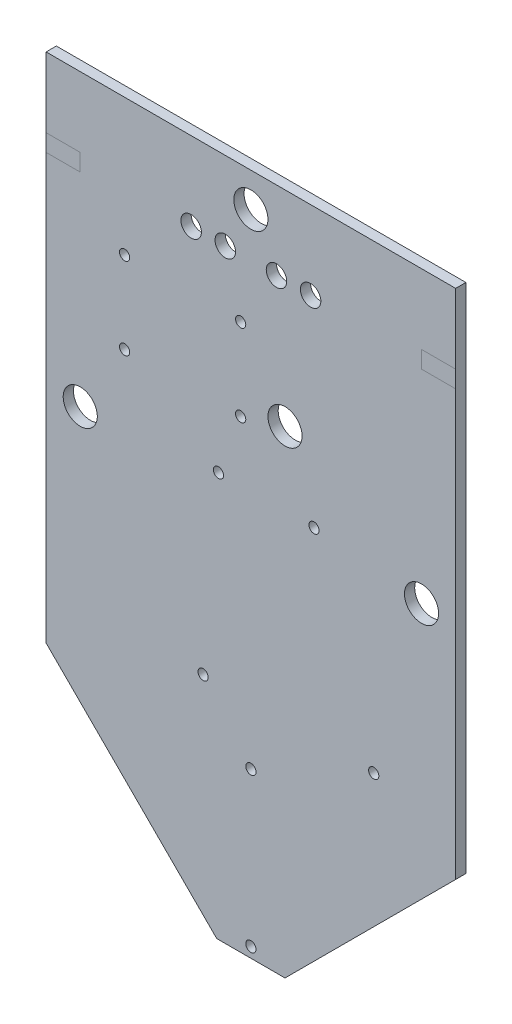
ISO-10303-21;
HEADER;
FILE_DESCRIPTION(('STEP AP214'),'2;1');
FILE_NAME('part.step','',(''),(''),'','','');
FILE_SCHEMA(('AUTOMOTIVE_DESIGN { 1 0 10303 214 1 1 1 1 }'));
ENDSEC;
DATA;
#1=APPLICATION_CONTEXT('core data for automotive mechanical design processes');
#2=APPLICATION_PROTOCOL_DEFINITION('international standard','automotive_design',2000,#1);
#3=PRODUCT_CONTEXT('',#1,'mechanical');
#4=PRODUCT('Part','Part','',(#3));
#5=PRODUCT_RELATED_PRODUCT_CATEGORY('part','',(#4));
#6=PRODUCT_DEFINITION_FORMATION('','',#4);
#7=PRODUCT_DEFINITION_CONTEXT('part definition',#1,'design');
#8=PRODUCT_DEFINITION('design','',#6,#7);
#9=PRODUCT_DEFINITION_SHAPE('','',#8);
#10=(LENGTH_UNIT() NAMED_UNIT(*) SI_UNIT(.MILLI.,.METRE.));
#11=(NAMED_UNIT(*) PLANE_ANGLE_UNIT() SI_UNIT($,.RADIAN.));
#12=(NAMED_UNIT(*) SI_UNIT($,.STERADIAN.) SOLID_ANGLE_UNIT());
#13=UNCERTAINTY_MEASURE_WITH_UNIT(LENGTH_MEASURE(1.E-05),#10,'distance_accuracy_value','');
#14=(GEOMETRIC_REPRESENTATION_CONTEXT(3) GLOBAL_UNCERTAINTY_ASSIGNED_CONTEXT((#13)) GLOBAL_UNIT_ASSIGNED_CONTEXT((#10,
#11,#12)) REPRESENTATION_CONTEXT('',''));
#15=CARTESIAN_POINT('',(0.,0.,0.));
#16=DIRECTION('',(0.,0.,1.));
#17=DIRECTION('',(1.,0.,0.));
#18=AXIS2_PLACEMENT_3D('',#15,#16,#17);
#19=CARTESIAN_POINT('',(0.,-200.,3.));
#20=DIRECTION('',(0.,0.,-1.));
#21=DIRECTION('',(-1.,0.,0.));
#22=AXIS2_PLACEMENT_3D('',#19,#20,#21);
#23=PLANE('',#22);
#24=CARTESIAN_POINT('',(-60.0000000000002,-197.,3.));
#25=DIRECTION('',(0.,0.,-1.));
#26=DIRECTION('',(-1.,0.,0.));
#27=AXIS2_PLACEMENT_3D('',#24,#25,#26);
#28=CIRCLE('',#27,1.5);
#29=CARTESIAN_POINT('',(-61.5000000000002,-197.,3.));
#30=VERTEX_POINT('',#29);
#31=EDGE_CURVE('E197',#30,#30,#28,.T.);
#32=ORIENTED_EDGE('',*,*,#31,.T.);
#33=EDGE_LOOP('',(#32));
#34=FACE_BOUND('',#33,.T.);
#35=CARTESIAN_POINT('',(-60.0000000000002,-152.,3.));
#36=DIRECTION('',(0.,0.,-1.));
#37=DIRECTION('',(-1.,0.,0.));
#38=AXIS2_PLACEMENT_3D('',#35,#36,#37);
#39=CIRCLE('',#38,1.5);
#40=CARTESIAN_POINT('',(-61.5000000000002,-152.,3.));
#41=VERTEX_POINT('',#40);
#42=EDGE_CURVE('E203',#41,#41,#39,.T.);
#43=ORIENTED_EDGE('',*,*,#42,.T.);
#44=EDGE_LOOP('',(#43));
#45=FACE_BOUND('',#44,.T.);
#46=CARTESIAN_POINT('',(-77.5,-23.,3.));
#47=DIRECTION('',(0.,0.,-1.));
#48=DIRECTION('',(-1.,0.,0.));
#49=AXIS2_PLACEMENT_3D('',#46,#47,#48);
#50=CIRCLE('',#49,3.00000000000001);
#51=CARTESIAN_POINT('',(-80.5,-23.,3.));
#52=VERTEX_POINT('',#51);
#53=EDGE_CURVE('E209',#52,#52,#50,.T.);
#54=ORIENTED_EDGE('',*,*,#53,.T.);
#55=EDGE_LOOP('',(#54));
#56=FACE_BOUND('',#55,.T.);
#57=CARTESIAN_POINT('',(-67.5,-23.,3.));
#58=DIRECTION('',(0.,0.,-1.));
#59=DIRECTION('',(-1.,0.,0.));
#60=AXIS2_PLACEMENT_3D('',#57,#58,#59);
#61=CIRCLE('',#60,3.00000000000001);
#62=CARTESIAN_POINT('',(-70.5,-23.,3.));
#63=VERTEX_POINT('',#62);
#64=EDGE_CURVE('E215',#63,#63,#61,.T.);
#65=ORIENTED_EDGE('',*,*,#64,.T.);
#66=EDGE_LOOP('',(#65));
#67=FACE_BOUND('',#66,.T.);
#68=CARTESIAN_POINT('',(-42.5,-23.,3.));
#69=DIRECTION('',(0.,0.,-1.));
#70=DIRECTION('',(-1.,0.,0.));
#71=AXIS2_PLACEMENT_3D('',#68,#69,#70);
#72=CIRCLE('',#71,3.);
#73=CARTESIAN_POINT('',(-45.5,-23.,3.));
#74=VERTEX_POINT('',#73);
#75=EDGE_CURVE('E221',#74,#74,#72,.T.);
#76=ORIENTED_EDGE('',*,*,#75,.T.);
#77=EDGE_LOOP('',(#76));
#78=FACE_BOUND('',#77,.T.);
#79=CARTESIAN_POINT('',(-52.5,-23.,3.));
#80=DIRECTION('',(0.,0.,-1.));
#81=DIRECTION('',(-1.,0.,0.));
#82=AXIS2_PLACEMENT_3D('',#79,#80,#81);
#83=CIRCLE('',#82,3.);
#84=CARTESIAN_POINT('',(-55.5,-23.,3.));
#85=VERTEX_POINT('',#84);
#86=EDGE_CURVE('E227',#85,#85,#83,.T.);
#87=ORIENTED_EDGE('',*,*,#86,.T.);
#88=EDGE_LOOP('',(#87));
#89=FACE_BOUND('',#88,.T.);
#90=CARTESIAN_POINT('',(-63.,-64.,3.));
#91=DIRECTION('',(0.,0.,-1.));
#92=DIRECTION('',(-1.,0.,0.));
#93=AXIS2_PLACEMENT_3D('',#90,#91,#92);
#94=CIRCLE('',#93,1.5);
#95=CARTESIAN_POINT('',(-64.5,-64.,3.));
#96=VERTEX_POINT('',#95);
#97=EDGE_CURVE('E239',#96,#96,#94,.F.);
#98=ORIENTED_EDGE('',*,*,#97,.F.);
#99=EDGE_LOOP('',(#98));
#100=FACE_BOUND('',#99,.T.);
#101=CARTESIAN_POINT('',(-97.,-40.,3.));
#102=DIRECTION('',(0.,0.,-1.));
#103=DIRECTION('',(-1.,0.,0.));
#104=AXIS2_PLACEMENT_3D('',#101,#102,#103);
#105=CIRCLE('',#104,1.5);
#106=CARTESIAN_POINT('',(-98.5,-40.,3.));
#107=VERTEX_POINT('',#106);
#108=EDGE_CURVE('E251',#107,#107,#105,.F.);
#109=ORIENTED_EDGE('',*,*,#108,.F.);
#110=EDGE_LOOP('',(#109));
#111=FACE_BOUND('',#110,.T.);
#112=CARTESIAN_POINT('',(-110.,-84.9999999999999,3.));
#113=DIRECTION('',(0.,0.,-1.));
#114=DIRECTION('',(-1.,0.,0.));
#115=AXIS2_PLACEMENT_3D('',#112,#113,#114);
#116=CIRCLE('',#115,5.00000000000002);
#117=CARTESIAN_POINT('',(-115.,-84.9999999999999,3.));
#118=VERTEX_POINT('',#117);
#119=EDGE_CURVE('E257',#118,#118,#116,.T.);
#120=ORIENTED_EDGE('',*,*,#119,.T.);
#121=EDGE_LOOP('',(#120));
#122=FACE_BOUND('',#121,.T.);
#123=CARTESIAN_POINT('',(-9.99999999999992,-85.,3.));
#124=DIRECTION('',(0.,0.,-1.));
#125=DIRECTION('',(-1.,0.,0.));
#126=AXIS2_PLACEMENT_3D('',#123,#124,#125);
#127=CIRCLE('',#126,5.);
#128=CARTESIAN_POINT('',(-14.9999999999999,-85.,3.));
#129=VERTEX_POINT('',#128);
#130=EDGE_CURVE('E263',#129,#129,#127,.T.);
#131=ORIENTED_EDGE('',*,*,#130,.T.);
#132=EDGE_LOOP('',(#131));
#133=FACE_BOUND('',#132,.T.);
#134=CARTESIAN_POINT('',(-60.,-10.,3.));
#135=DIRECTION('',(0.,0.,-1.));
#136=DIRECTION('',(-1.,0.,0.));
#137=AXIS2_PLACEMENT_3D('',#134,#135,#136);
#138=CIRCLE('',#137,5.);
#139=CARTESIAN_POINT('',(-65.,-10.,3.));
#140=VERTEX_POINT('',#139);
#141=EDGE_CURVE('E269',#140,#140,#138,.T.);
#142=ORIENTED_EDGE('',*,*,#141,.T.);
#143=EDGE_LOOP('',(#142));
#144=FACE_BOUND('',#143,.T.);
#145=CARTESIAN_POINT('',(-50.,-60.,3.));
#146=DIRECTION('',(0.,0.,-1.));
#147=DIRECTION('',(-1.,0.,0.));
#148=AXIS2_PLACEMENT_3D('',#145,#146,#147);
#149=CIRCLE('',#148,5.);
#150=CARTESIAN_POINT('',(-55.,-60.,3.));
#151=VERTEX_POINT('',#150);
#152=EDGE_CURVE('E275',#151,#151,#149,.T.);
#153=ORIENTED_EDGE('',*,*,#152,.T.);
#154=EDGE_LOOP('',(#153));
#155=FACE_BOUND('',#154,.T.);
#156=CARTESIAN_POINT('',(-74.,-135.,3.));
#157=DIRECTION('',(0.,0.,-1.));
#158=DIRECTION('',(-1.,0.,0.));
#159=AXIS2_PLACEMENT_3D('',#156,#157,#158);
#160=CIRCLE('',#159,1.5);
#161=CARTESIAN_POINT('',(-75.5,-135.,3.));
#162=VERTEX_POINT('',#161);
#163=EDGE_CURVE('E287',#162,#162,#160,.F.);
#164=ORIENTED_EDGE('',*,*,#163,.F.);
#165=EDGE_LOOP('',(#164));
#166=FACE_BOUND('',#165,.T.);
#167=CARTESIAN_POINT('',(-69.5,-81.5,3.));
#168=DIRECTION('',(0.,0.,-1.));
#169=DIRECTION('',(-1.,0.,0.));
#170=AXIS2_PLACEMENT_3D('',#167,#168,#169);
#171=CIRCLE('',#170,1.5);
#172=CARTESIAN_POINT('',(-71.,-81.5,3.));
#173=VERTEX_POINT('',#172);
#174=EDGE_CURVE('E299',#173,#173,#171,.F.);
#175=ORIENTED_EDGE('',*,*,#174,.F.);
#176=EDGE_LOOP('',(#175));
#177=FACE_BOUND('',#176,.T.);
#178=DIRECTION('',(0.,-1.,0.));
#179=VECTOR('',#178,1.);
#180=CARTESIAN_POINT('',(-9.99999999999999,-20.5,3.));
#181=LINE('',#180,#179);
#182=CARTESIAN_POINT('',(-9.99999999999999,-20.5,3.));
#183=VERTEX_POINT('',#182);
#184=CARTESIAN_POINT('',(-9.99999999999999,-25.5,3.));
#185=VERTEX_POINT('',#184);
#186=EDGE_CURVE('E156',#183,#185,#181,.T.);
#187=ORIENTED_EDGE('',*,*,#186,.F.);
#188=DIRECTION('',(-1.,0.,0.));
#189=VECTOR('',#188,1.);
#190=CARTESIAN_POINT('',(0.,-20.5,3.));
#191=LINE('',#190,#189);
#192=CARTESIAN_POINT('',(0.,-20.5,3.));
#193=VERTEX_POINT('',#192);
#194=EDGE_CURVE('E141',#193,#183,#191,.T.);
#195=ORIENTED_EDGE('',*,*,#194,.F.);
#196=DIRECTION('',(0.,1.,0.));
#197=VECTOR('',#196,1.);
#198=CARTESIAN_POINT('',(0.,-150.,3.));
#199=LINE('',#198,#197);
#200=CARTESIAN_POINT('',(0.,0.,3.));
#201=VERTEX_POINT('',#200);
#202=EDGE_CURVE('E307',#193,#201,#199,.T.);
#203=ORIENTED_EDGE('',*,*,#202,.T.);
#204=DIRECTION('',(-1.,0.,0.));
#205=VECTOR('',#204,1.);
#206=CARTESIAN_POINT('',(0.,0.,3.));
#207=LINE('',#206,#205);
#208=CARTESIAN_POINT('',(-120.,0.,3.));
#209=VERTEX_POINT('',#208);
#210=EDGE_CURVE('E306',#201,#209,#207,.T.);
#211=ORIENTED_EDGE('',*,*,#210,.T.);
#212=DIRECTION('',(0.,-1.,0.));
#213=VECTOR('',#212,1.);
#214=CARTESIAN_POINT('',(-120.,0.,3.));
#215=LINE('',#214,#213);
#216=CARTESIAN_POINT('',(-120.,-20.5,3.));
#217=VERTEX_POINT('',#216);
#218=EDGE_CURVE('E310',#209,#217,#215,.T.);
#219=ORIENTED_EDGE('',*,*,#218,.T.);
#220=DIRECTION('',(-1.,0.,0.));
#221=VECTOR('',#220,1.);
#222=CARTESIAN_POINT('',(-120.,-20.5,3.));
#223=LINE('',#222,#221);
#224=CARTESIAN_POINT('',(-110.,-20.5,3.));
#225=VERTEX_POINT('',#224);
#226=EDGE_CURVE('E173',#225,#217,#223,.T.);
#227=ORIENTED_EDGE('',*,*,#226,.F.);
#228=DIRECTION('',(0.,1.,0.));
#229=VECTOR('',#228,1.);
#230=CARTESIAN_POINT('',(-110.,-20.5,3.));
#231=LINE('',#230,#229);
#232=CARTESIAN_POINT('',(-110.,-25.5,3.));
#233=VERTEX_POINT('',#232);
#234=EDGE_CURVE('E182',#233,#225,#231,.T.);
#235=ORIENTED_EDGE('',*,*,#234,.F.);
#236=DIRECTION('',(1.,0.,0.));
#237=VECTOR('',#236,1.);
#238=CARTESIAN_POINT('',(-120.,-25.5,3.));
#239=LINE('',#238,#237);
#240=CARTESIAN_POINT('',(-120.,-25.5,3.));
#241=VERTEX_POINT('',#240);
#242=EDGE_CURVE('E165',#241,#233,#239,.T.);
#243=ORIENTED_EDGE('',*,*,#242,.F.);
#244=CARTESIAN_POINT('',(-120.,-150.,3.));
#245=VERTEX_POINT('',#244);
#246=EDGE_CURVE('E309',#241,#245,#215,.T.);
#247=ORIENTED_EDGE('',*,*,#246,.T.);
#248=DIRECTION('',(0.707106781186546,-0.707106781186549,0.));
#249=VECTOR('',#248,1.);
#250=CARTESIAN_POINT('',(-120.,-150.,3.));
#251=LINE('',#250,#249);
#252=CARTESIAN_POINT('',(-70.0000000000002,-200.,3.));
#253=VERTEX_POINT('',#252);
#254=EDGE_CURVE('E313',#245,#253,#251,.T.);
#255=ORIENTED_EDGE('',*,*,#254,.T.);
#256=DIRECTION('',(1.,0.,0.));
#257=VECTOR('',#256,1.);
#258=CARTESIAN_POINT('',(-70.0000000000002,-200.,3.));
#259=LINE('',#258,#257);
#260=CARTESIAN_POINT('',(-50.0000000000002,-200.,3.));
#261=VERTEX_POINT('',#260);
#262=EDGE_CURVE('E315',#253,#261,#259,.T.);
#263=ORIENTED_EDGE('',*,*,#262,.T.);
#264=DIRECTION('',(0.707106781186548,0.707106781186547,0.));
#265=VECTOR('',#264,1.);
#266=CARTESIAN_POINT('',(-50.0000000000002,-200.,3.));
#267=LINE('',#266,#265);
#268=CARTESIAN_POINT('',(0.,-150.,3.));
#269=VERTEX_POINT('',#268);
#270=EDGE_CURVE('E317',#261,#269,#267,.T.);
#271=ORIENTED_EDGE('',*,*,#270,.T.);
#272=CARTESIAN_POINT('',(0.,-25.5,3.));
#273=VERTEX_POINT('',#272);
#274=EDGE_CURVE('E303',#269,#273,#199,.T.);
#275=ORIENTED_EDGE('',*,*,#274,.T.);
#276=DIRECTION('',(1.,0.,0.));
#277=VECTOR('',#276,1.);
#278=CARTESIAN_POINT('',(0.,-25.5,3.));
#279=LINE('',#278,#277);
#280=EDGE_CURVE('E154',#185,#273,#279,.T.);
#281=ORIENTED_EDGE('',*,*,#280,.F.);
#282=EDGE_LOOP('',(#187,#195,#203,#211,#219,#227,#235,#243,#247,#255,#263,#271,#275,#281));
#283=FACE_BOUND('',#282,.T.);
#284=CARTESIAN_POINT('',(-41.5,-81.5,3.));
#285=DIRECTION('',(0.,0.,-1.));
#286=DIRECTION('',(-1.,0.,0.));
#287=AXIS2_PLACEMENT_3D('',#284,#285,#286);
#288=CIRCLE('',#287,1.5);
#289=CARTESIAN_POINT('',(-43.,-81.5,3.));
#290=VERTEX_POINT('',#289);
#291=EDGE_CURVE('E293',#290,#290,#288,.F.);
#292=ORIENTED_EDGE('',*,*,#291,.F.);
#293=EDGE_LOOP('',(#292));
#294=FACE_BOUND('',#293,.T.);
#295=CARTESIAN_POINT('',(-24.,-135.,3.));
#296=DIRECTION('',(0.,0.,-1.));
#297=DIRECTION('',(-1.,0.,0.));
#298=AXIS2_PLACEMENT_3D('',#295,#296,#297);
#299=CIRCLE('',#298,1.5);
#300=CARTESIAN_POINT('',(-25.5,-135.,3.));
#301=VERTEX_POINT('',#300);
#302=EDGE_CURVE('E281',#301,#301,#299,.F.);
#303=ORIENTED_EDGE('',*,*,#302,.F.);
#304=EDGE_LOOP('',(#303));
#305=FACE_BOUND('',#304,.T.);
#306=CARTESIAN_POINT('',(-63.,-40.,3.));
#307=DIRECTION('',(0.,0.,-1.));
#308=DIRECTION('',(-1.,0.,0.));
#309=AXIS2_PLACEMENT_3D('',#306,#307,#308);
#310=CIRCLE('',#309,1.5);
#311=CARTESIAN_POINT('',(-64.5,-40.,3.));
#312=VERTEX_POINT('',#311);
#313=EDGE_CURVE('E245',#312,#312,#310,.F.);
#314=ORIENTED_EDGE('',*,*,#313,.F.);
#315=EDGE_LOOP('',(#314));
#316=FACE_BOUND('',#315,.T.);
#317=CARTESIAN_POINT('',(-97.,-64.,3.));
#318=DIRECTION('',(0.,0.,-1.));
#319=DIRECTION('',(-1.,0.,0.));
#320=AXIS2_PLACEMENT_3D('',#317,#318,#319);
#321=CIRCLE('',#320,1.5);
#322=CARTESIAN_POINT('',(-98.5,-64.,3.));
#323=VERTEX_POINT('',#322);
#324=EDGE_CURVE('E233',#323,#323,#321,.F.);
#325=ORIENTED_EDGE('',*,*,#324,.F.);
#326=EDGE_LOOP('',(#325));
#327=FACE_BOUND('',#326,.T.);
#328=ADVANCED_FACE('F31',(#34,#45,#56,#67,#78,#89,#100,#111,#122,#133,#144,#155,#166,#177,#283,
#294,#305,#316,#327),#23,.F.);
#329=CARTESIAN_POINT('',(0.,-200.,0.));
#330=DIRECTION('',(0.,0.,-1.));
#331=DIRECTION('',(-1.,0.,0.));
#332=AXIS2_PLACEMENT_3D('',#329,#330,#331);
#333=PLANE('',#332);
#334=CARTESIAN_POINT('',(-60.0000000000002,-197.,0.));
#335=DIRECTION('',(0.,0.,-1.));
#336=DIRECTION('',(-1.,0.,0.));
#337=AXIS2_PLACEMENT_3D('',#334,#335,#336);
#338=CIRCLE('',#337,1.5);
#339=CARTESIAN_POINT('',(-61.5000000000002,-197.,0.));
#340=VERTEX_POINT('',#339);
#341=EDGE_CURVE('E189',#340,#340,#338,.T.);
#342=ORIENTED_EDGE('',*,*,#341,.F.);
#343=EDGE_LOOP('',(#342));
#344=FACE_BOUND('',#343,.T.);
#345=CARTESIAN_POINT('',(-60.0000000000002,-152.,0.));
#346=DIRECTION('',(0.,0.,-1.));
#347=DIRECTION('',(-1.,0.,0.));
#348=AXIS2_PLACEMENT_3D('',#345,#346,#347);
#349=CIRCLE('',#348,1.5);
#350=CARTESIAN_POINT('',(-61.5000000000002,-152.,0.));
#351=VERTEX_POINT('',#350);
#352=EDGE_CURVE('E200',#351,#351,#349,.T.);
#353=ORIENTED_EDGE('',*,*,#352,.F.);
#354=EDGE_LOOP('',(#353));
#355=FACE_BOUND('',#354,.T.);
#356=CARTESIAN_POINT('',(-77.5,-23.,0.));
#357=DIRECTION('',(0.,0.,-1.));
#358=DIRECTION('',(1.,0.,0.));
#359=AXIS2_PLACEMENT_3D('',#356,#357,#358);
#360=CIRCLE('',#359,3.00000000000001);
#361=CARTESIAN_POINT('',(-74.5,-23.,0.));
#362=VERTEX_POINT('',#361);
#363=EDGE_CURVE('E206',#362,#362,#360,.T.);
#364=ORIENTED_EDGE('',*,*,#363,.F.);
#365=EDGE_LOOP('',(#364));
#366=FACE_BOUND('',#365,.T.);
#367=CARTESIAN_POINT('',(-67.5,-23.,0.));
#368=DIRECTION('',(0.,0.,-1.));
#369=DIRECTION('',(1.,0.,0.));
#370=AXIS2_PLACEMENT_3D('',#367,#368,#369);
#371=CIRCLE('',#370,3.00000000000001);
#372=CARTESIAN_POINT('',(-64.5,-23.,0.));
#373=VERTEX_POINT('',#372);
#374=EDGE_CURVE('E212',#373,#373,#371,.T.);
#375=ORIENTED_EDGE('',*,*,#374,.F.);
#376=EDGE_LOOP('',(#375));
#377=FACE_BOUND('',#376,.T.);
#378=CARTESIAN_POINT('',(-42.5,-23.,0.));
#379=DIRECTION('',(0.,0.,-1.));
#380=DIRECTION('',(-1.,0.,0.));
#381=AXIS2_PLACEMENT_3D('',#378,#379,#380);
#382=CIRCLE('',#381,3.);
#383=CARTESIAN_POINT('',(-45.5,-23.,0.));
#384=VERTEX_POINT('',#383);
#385=EDGE_CURVE('E218',#384,#384,#382,.T.);
#386=ORIENTED_EDGE('',*,*,#385,.F.);
#387=EDGE_LOOP('',(#386));
#388=FACE_BOUND('',#387,.T.);
#389=CARTESIAN_POINT('',(-52.5,-23.,0.));
#390=DIRECTION('',(0.,0.,-1.));
#391=DIRECTION('',(-1.,0.,0.));
#392=AXIS2_PLACEMENT_3D('',#389,#390,#391);
#393=CIRCLE('',#392,3.);
#394=CARTESIAN_POINT('',(-55.5,-23.,0.));
#395=VERTEX_POINT('',#394);
#396=EDGE_CURVE('E224',#395,#395,#393,.T.);
#397=ORIENTED_EDGE('',*,*,#396,.F.);
#398=EDGE_LOOP('',(#397));
#399=FACE_BOUND('',#398,.T.);
#400=CARTESIAN_POINT('',(-63.,-64.,0.));
#401=DIRECTION('',(0.,0.,1.));
#402=DIRECTION('',(1.,0.,0.));
#403=AXIS2_PLACEMENT_3D('',#400,#401,#402);
#404=CIRCLE('',#403,1.5);
#405=CARTESIAN_POINT('',(-61.5,-64.,0.));
#406=VERTEX_POINT('',#405);
#407=EDGE_CURVE('E236',#406,#406,#404,.T.);
#408=ORIENTED_EDGE('',*,*,#407,.T.);
#409=EDGE_LOOP('',(#408));
#410=FACE_BOUND('',#409,.T.);
#411=CARTESIAN_POINT('',(-97.,-40.,0.));
#412=DIRECTION('',(0.,0.,1.));
#413=DIRECTION('',(1.,0.,0.));
#414=AXIS2_PLACEMENT_3D('',#411,#412,#413);
#415=CIRCLE('',#414,1.5);
#416=CARTESIAN_POINT('',(-95.5,-40.,0.));
#417=VERTEX_POINT('',#416);
#418=EDGE_CURVE('E248',#417,#417,#415,.T.);
#419=ORIENTED_EDGE('',*,*,#418,.T.);
#420=EDGE_LOOP('',(#419));
#421=FACE_BOUND('',#420,.T.);
#422=CARTESIAN_POINT('',(-110.,-84.9999999999999,0.));
#423=DIRECTION('',(0.,0.,-1.));
#424=DIRECTION('',(-1.,0.,0.));
#425=AXIS2_PLACEMENT_3D('',#422,#423,#424);
#426=CIRCLE('',#425,5.00000000000002);
#427=CARTESIAN_POINT('',(-115.,-84.9999999999999,0.));
#428=VERTEX_POINT('',#427);
#429=EDGE_CURVE('E254',#428,#428,#426,.T.);
#430=ORIENTED_EDGE('',*,*,#429,.F.);
#431=EDGE_LOOP('',(#430));
#432=FACE_BOUND('',#431,.T.);
#433=CARTESIAN_POINT('',(-9.99999999999992,-85.,0.));
#434=DIRECTION('',(0.,0.,-1.));
#435=DIRECTION('',(-1.,0.,0.));
#436=AXIS2_PLACEMENT_3D('',#433,#434,#435);
#437=CIRCLE('',#436,5.);
#438=CARTESIAN_POINT('',(-14.9999999999999,-85.,0.));
#439=VERTEX_POINT('',#438);
#440=EDGE_CURVE('E260',#439,#439,#437,.T.);
#441=ORIENTED_EDGE('',*,*,#440,.F.);
#442=EDGE_LOOP('',(#441));
#443=FACE_BOUND('',#442,.T.);
#444=CARTESIAN_POINT('',(-60.,-10.,0.));
#445=DIRECTION('',(0.,0.,-1.));
#446=DIRECTION('',(-1.,0.,0.));
#447=AXIS2_PLACEMENT_3D('',#444,#445,#446);
#448=CIRCLE('',#447,5.);
#449=CARTESIAN_POINT('',(-65.,-10.,0.));
#450=VERTEX_POINT('',#449);
#451=EDGE_CURVE('E266',#450,#450,#448,.T.);
#452=ORIENTED_EDGE('',*,*,#451,.F.);
#453=EDGE_LOOP('',(#452));
#454=FACE_BOUND('',#453,.T.);
#455=CARTESIAN_POINT('',(-50.,-60.,0.));
#456=DIRECTION('',(0.,0.,-1.));
#457=DIRECTION('',(-1.,0.,0.));
#458=AXIS2_PLACEMENT_3D('',#455,#456,#457);
#459=CIRCLE('',#458,5.);
#460=CARTESIAN_POINT('',(-55.,-60.,0.));
#461=VERTEX_POINT('',#460);
#462=EDGE_CURVE('E272',#461,#461,#459,.T.);
#463=ORIENTED_EDGE('',*,*,#462,.F.);
#464=EDGE_LOOP('',(#463));
#465=FACE_BOUND('',#464,.T.);
#466=CARTESIAN_POINT('',(-74.,-135.,0.));
#467=DIRECTION('',(0.,0.,1.));
#468=DIRECTION('',(1.,0.,0.));
#469=AXIS2_PLACEMENT_3D('',#466,#467,#468);
#470=CIRCLE('',#469,1.5);
#471=CARTESIAN_POINT('',(-72.5,-135.,0.));
#472=VERTEX_POINT('',#471);
#473=EDGE_CURVE('E284',#472,#472,#470,.T.);
#474=ORIENTED_EDGE('',*,*,#473,.T.);
#475=EDGE_LOOP('',(#474));
#476=FACE_BOUND('',#475,.T.);
#477=CARTESIAN_POINT('',(-69.5,-81.5,0.));
#478=DIRECTION('',(0.,0.,1.));
#479=DIRECTION('',(1.,0.,0.));
#480=AXIS2_PLACEMENT_3D('',#477,#478,#479);
#481=CIRCLE('',#480,1.5);
#482=CARTESIAN_POINT('',(-68.,-81.5,0.));
#483=VERTEX_POINT('',#482);
#484=EDGE_CURVE('E296',#483,#483,#481,.T.);
#485=ORIENTED_EDGE('',*,*,#484,.T.);
#486=EDGE_LOOP('',(#485));
#487=FACE_BOUND('',#486,.T.);
#488=DIRECTION('',(0.,1.,0.));
#489=VECTOR('',#488,1.);
#490=CARTESIAN_POINT('',(0.,-150.,0.));
#491=LINE('',#490,#489);
#492=CARTESIAN_POINT('',(0.,-150.,0.));
#493=VERTEX_POINT('',#492);
#494=CARTESIAN_POINT('',(0.,0.,0.));
#495=VERTEX_POINT('',#494);
#496=EDGE_CURVE('E302',#493,#495,#491,.T.);
#497=ORIENTED_EDGE('',*,*,#496,.F.);
#498=DIRECTION('',(0.707106781186548,0.707106781186547,0.));
#499=VECTOR('',#498,1.);
#500=CARTESIAN_POINT('',(-50.0000000000002,-200.,0.));
#501=LINE('',#500,#499);
#502=CARTESIAN_POINT('',(-50.0000000000002,-200.,0.));
#503=VERTEX_POINT('',#502);
#504=EDGE_CURVE('E330',#503,#493,#501,.T.);
#505=ORIENTED_EDGE('',*,*,#504,.F.);
#506=DIRECTION('',(1.,0.,0.));
#507=VECTOR('',#506,1.);
#508=CARTESIAN_POINT('',(-70.0000000000002,-200.,0.));
#509=LINE('',#508,#507);
#510=CARTESIAN_POINT('',(-70.0000000000002,-200.,0.));
#511=VERTEX_POINT('',#510);
#512=EDGE_CURVE('E328',#511,#503,#509,.T.);
#513=ORIENTED_EDGE('',*,*,#512,.F.);
#514=DIRECTION('',(0.707106781186546,-0.707106781186549,0.));
#515=VECTOR('',#514,1.);
#516=CARTESIAN_POINT('',(-120.,-150.,0.));
#517=LINE('',#516,#515);
#518=CARTESIAN_POINT('',(-120.,-150.,0.));
#519=VERTEX_POINT('',#518);
#520=EDGE_CURVE('E326',#519,#511,#517,.T.);
#521=ORIENTED_EDGE('',*,*,#520,.F.);
#522=DIRECTION('',(0.,-1.,0.));
#523=VECTOR('',#522,1.);
#524=CARTESIAN_POINT('',(-120.,0.,0.));
#525=LINE('',#524,#523);
#526=CARTESIAN_POINT('',(-120.,0.,0.));
#527=VERTEX_POINT('',#526);
#528=EDGE_CURVE('E324',#527,#519,#525,.T.);
#529=ORIENTED_EDGE('',*,*,#528,.F.);
#530=DIRECTION('',(-1.,0.,0.));
#531=VECTOR('',#530,1.);
#532=CARTESIAN_POINT('',(0.,0.,0.));
#533=LINE('',#532,#531);
#534=EDGE_CURVE('E322',#495,#527,#533,.T.);
#535=ORIENTED_EDGE('',*,*,#534,.F.);
#536=EDGE_LOOP('',(#497,#505,#513,#521,#529,#535));
#537=FACE_BOUND('',#536,.T.);
#538=CARTESIAN_POINT('',(-41.5,-81.5,0.));
#539=DIRECTION('',(0.,0.,1.));
#540=DIRECTION('',(1.,0.,0.));
#541=AXIS2_PLACEMENT_3D('',#538,#539,#540);
#542=CIRCLE('',#541,1.5);
#543=CARTESIAN_POINT('',(-40.,-81.5,0.));
#544=VERTEX_POINT('',#543);
#545=EDGE_CURVE('E290',#544,#544,#542,.T.);
#546=ORIENTED_EDGE('',*,*,#545,.T.);
#547=EDGE_LOOP('',(#546));
#548=FACE_BOUND('',#547,.T.);
#549=CARTESIAN_POINT('',(-24.,-135.,0.));
#550=DIRECTION('',(0.,0.,1.));
#551=DIRECTION('',(1.,0.,0.));
#552=AXIS2_PLACEMENT_3D('',#549,#550,#551);
#553=CIRCLE('',#552,1.5);
#554=CARTESIAN_POINT('',(-22.5,-135.,0.));
#555=VERTEX_POINT('',#554);
#556=EDGE_CURVE('E278',#555,#555,#553,.T.);
#557=ORIENTED_EDGE('',*,*,#556,.T.);
#558=EDGE_LOOP('',(#557));
#559=FACE_BOUND('',#558,.T.);
#560=CARTESIAN_POINT('',(-63.,-40.,0.));
#561=DIRECTION('',(0.,0.,1.));
#562=DIRECTION('',(1.,0.,0.));
#563=AXIS2_PLACEMENT_3D('',#560,#561,#562);
#564=CIRCLE('',#563,1.5);
#565=CARTESIAN_POINT('',(-61.5,-40.,0.));
#566=VERTEX_POINT('',#565);
#567=EDGE_CURVE('E242',#566,#566,#564,.T.);
#568=ORIENTED_EDGE('',*,*,#567,.T.);
#569=EDGE_LOOP('',(#568));
#570=FACE_BOUND('',#569,.T.);
#571=CARTESIAN_POINT('',(-97.,-64.,0.));
#572=DIRECTION('',(0.,0.,1.));
#573=DIRECTION('',(1.,0.,0.));
#574=AXIS2_PLACEMENT_3D('',#571,#572,#573);
#575=CIRCLE('',#574,1.5);
#576=CARTESIAN_POINT('',(-95.5,-64.,0.));
#577=VERTEX_POINT('',#576);
#578=EDGE_CURVE('E230',#577,#577,#575,.T.);
#579=ORIENTED_EDGE('',*,*,#578,.T.);
#580=EDGE_LOOP('',(#579));
#581=FACE_BOUND('',#580,.T.);
#582=ADVANCED_FACE('F355',(#344,#355,#366,#377,#388,#399,#410,#421,#432,#443,#454,#465,#476,
#487,#537,#548,#559,#570,#581),#333,.T.);
#583=CARTESIAN_POINT('',(0.,-150.,3.));
#584=DIRECTION('',(-1.,0.,0.));
#585=DIRECTION('',(0.,0.,1.));
#586=AXIS2_PLACEMENT_3D('',#583,#584,#585);
#587=PLANE('',#586);
#588=ORIENTED_EDGE('',*,*,#202,.F.);
#589=DIRECTION('',(0.,0.,1.));
#590=VECTOR('',#589,1.);
#591=CARTESIAN_POINT('',(0.,-20.5,2.9999));
#592=LINE('',#591,#590);
#593=CARTESIAN_POINT('',(0.,-20.5,2.9999));
#594=VERTEX_POINT('',#593);
#595=EDGE_CURVE('E163',#594,#193,#592,.T.);
#596=ORIENTED_EDGE('',*,*,#595,.F.);
#597=DIRECTION('',(0.,1.,0.));
#598=VECTOR('',#597,1.);
#599=CARTESIAN_POINT('',(0.,-20.5,2.9999));
#600=LINE('',#599,#598);
#601=CARTESIAN_POINT('',(0.,-25.5,2.9999));
#602=VERTEX_POINT('',#601);
#603=EDGE_CURVE('E146',#602,#594,#600,.T.);
#604=ORIENTED_EDGE('',*,*,#603,.F.);
#605=DIRECTION('',(0.,0.,1.));
#606=VECTOR('',#605,1.);
#607=CARTESIAN_POINT('',(0.,-25.5,2.9999));
#608=LINE('',#607,#606);
#609=EDGE_CURVE('E166',#602,#273,#608,.T.);
#610=ORIENTED_EDGE('',*,*,#609,.T.);
#611=ORIENTED_EDGE('',*,*,#274,.F.);
#612=DIRECTION('',(0.,0.,-1.));
#613=VECTOR('',#612,1.);
#614=CARTESIAN_POINT('',(0.,-150.,3.));
#615=LINE('',#614,#613);
#616=EDGE_CURVE('E319',#269,#493,#615,.T.);
#617=ORIENTED_EDGE('',*,*,#616,.T.);
#618=ORIENTED_EDGE('',*,*,#496,.T.);
#619=DIRECTION('',(0.,0.,-1.));
#620=VECTOR('',#619,1.);
#621=CARTESIAN_POINT('',(0.,0.,3.));
#622=LINE('',#621,#620);
#623=EDGE_CURVE('E11',#201,#495,#622,.T.);
#624=ORIENTED_EDGE('',*,*,#623,.F.);
#625=EDGE_LOOP('',(#588,#596,#604,#610,#611,#617,#618,#624));
#626=FACE_BOUND('',#625,.T.);
#627=ADVANCED_FACE('F33',(#626),#587,.F.);
#628=CARTESIAN_POINT('',(0.,0.,3.));
#629=DIRECTION('',(0.,-1.,0.));
#630=DIRECTION('',(1.,0.,0.));
#631=AXIS2_PLACEMENT_3D('',#628,#629,#630);
#632=PLANE('',#631);
#633=ORIENTED_EDGE('',*,*,#534,.T.);
#634=DIRECTION('',(0.,0.,-1.));
#635=VECTOR('',#634,1.);
#636=CARTESIAN_POINT('',(-120.,0.,3.));
#637=LINE('',#636,#635);
#638=EDGE_CURVE('E39',#209,#527,#637,.T.);
#639=ORIENTED_EDGE('',*,*,#638,.F.);
#640=ORIENTED_EDGE('',*,*,#210,.F.);
#641=ORIENTED_EDGE('',*,*,#623,.T.);
#642=EDGE_LOOP('',(#633,#639,#640,#641));
#643=FACE_BOUND('',#642,.T.);
#644=ADVANCED_FACE('F412',(#643),#632,.F.);
#645=CARTESIAN_POINT('',(-120.,0.,3.));
#646=DIRECTION('',(1.,0.,0.));
#647=DIRECTION('',(0.,1.,0.));
#648=AXIS2_PLACEMENT_3D('',#645,#646,#647);
#649=PLANE('',#648);
#650=DIRECTION('',(0.,-1.,0.));
#651=VECTOR('',#650,1.);
#652=CARTESIAN_POINT('',(-120.,-20.5,2.9999));
#653=LINE('',#652,#651);
#654=CARTESIAN_POINT('',(-120.,-20.5,2.9999));
#655=VERTEX_POINT('',#654);
#656=CARTESIAN_POINT('',(-120.,-25.5,2.9999));
#657=VERTEX_POINT('',#656);
#658=EDGE_CURVE('E170',#655,#657,#653,.T.);
#659=ORIENTED_EDGE('',*,*,#658,.F.);
#660=DIRECTION('',(0.,0.,1.));
#661=VECTOR('',#660,1.);
#662=CARTESIAN_POINT('',(-120.,-20.5,2.9999));
#663=LINE('',#662,#661);
#664=EDGE_CURVE('E186',#655,#217,#663,.T.);
#665=ORIENTED_EDGE('',*,*,#664,.T.);
#666=ORIENTED_EDGE('',*,*,#218,.F.);
#667=ORIENTED_EDGE('',*,*,#638,.T.);
#668=ORIENTED_EDGE('',*,*,#528,.T.);
#669=DIRECTION('',(0.,0.,-1.));
#670=VECTOR('',#669,1.);
#671=CARTESIAN_POINT('',(-120.,-150.,3.));
#672=LINE('',#671,#670);
#673=EDGE_CURVE('E340',#245,#519,#672,.T.);
#674=ORIENTED_EDGE('',*,*,#673,.F.);
#675=ORIENTED_EDGE('',*,*,#246,.F.);
#676=DIRECTION('',(0.,0.,1.));
#677=VECTOR('',#676,1.);
#678=CARTESIAN_POINT('',(-120.,-25.5,2.9999));
#679=LINE('',#678,#677);
#680=EDGE_CURVE('E179',#657,#241,#679,.T.);
#681=ORIENTED_EDGE('',*,*,#680,.F.);
#682=EDGE_LOOP('',(#659,#665,#666,#667,#668,#674,#675,#681));
#683=FACE_BOUND('',#682,.T.);
#684=ADVANCED_FACE('F348',(#683),#649,.F.);
#685=CARTESIAN_POINT('',(-120.,-150.,3.));
#686=DIRECTION('',(0.707106781186549,0.707106781186546,0.));
#687=DIRECTION('',(-0.707106781186546,0.707106781186549,0.));
#688=AXIS2_PLACEMENT_3D('',#685,#686,#687);
#689=PLANE('',#688);
#690=ORIENTED_EDGE('',*,*,#520,.T.);
#691=DIRECTION('',(0.,0.,-1.));
#692=VECTOR('',#691,1.);
#693=CARTESIAN_POINT('',(-70.0000000000002,-200.,3.));
#694=LINE('',#693,#692);
#695=EDGE_CURVE('E337',#253,#511,#694,.T.);
#696=ORIENTED_EDGE('',*,*,#695,.F.);
#697=ORIENTED_EDGE('',*,*,#254,.F.);
#698=ORIENTED_EDGE('',*,*,#673,.T.);
#699=EDGE_LOOP('',(#690,#696,#697,#698));
#700=FACE_BOUND('',#699,.T.);
#701=ADVANCED_FACE('F361',(#700),#689,.F.);
#702=CARTESIAN_POINT('',(-70.0000000000002,-200.,3.));
#703=DIRECTION('',(0.,1.,0.));
#704=DIRECTION('',(0.,0.,1.));
#705=AXIS2_PLACEMENT_3D('',#702,#703,#704);
#706=PLANE('',#705);
#707=ORIENTED_EDGE('',*,*,#512,.T.);
#708=DIRECTION('',(0.,0.,-1.));
#709=VECTOR('',#708,1.);
#710=CARTESIAN_POINT('',(-50.0000000000002,-200.,3.));
#711=LINE('',#710,#709);
#712=EDGE_CURVE('E334',#261,#503,#711,.T.);
#713=ORIENTED_EDGE('',*,*,#712,.F.);
#714=ORIENTED_EDGE('',*,*,#262,.F.);
#715=ORIENTED_EDGE('',*,*,#695,.T.);
#716=EDGE_LOOP('',(#707,#713,#714,#715));
#717=FACE_BOUND('',#716,.T.);
#718=ADVANCED_FACE('F365',(#717),#706,.F.);
#719=CARTESIAN_POINT('',(-50.0000000000002,-200.,3.));
#720=DIRECTION('',(-0.707106781186547,0.707106781186548,0.));
#721=DIRECTION('',(-0.707106781186548,-0.707106781186547,0.));
#722=AXIS2_PLACEMENT_3D('',#719,#720,#721);
#723=PLANE('',#722);
#724=ORIENTED_EDGE('',*,*,#504,.T.);
#725=ORIENTED_EDGE('',*,*,#616,.F.);
#726=ORIENTED_EDGE('',*,*,#270,.F.);
#727=ORIENTED_EDGE('',*,*,#712,.T.);
#728=EDGE_LOOP('',(#724,#725,#726,#727));
#729=FACE_BOUND('',#728,.T.);
#730=ADVANCED_FACE('F403',(#729),#723,.F.);
#731=CARTESIAN_POINT('',(-69.5,-81.5,16.));
#732=DIRECTION('',(0.,0.,-1.));
#733=DIRECTION('',(-1.,0.,0.));
#734=AXIS2_PLACEMENT_3D('',#731,#732,#733);
#735=CYLINDRICAL_SURFACE('',#734,1.5);
#736=ORIENTED_EDGE('',*,*,#484,.F.);
#737=EDGE_LOOP('',(#736));
#738=FACE_BOUND('',#737,.T.);
#739=ORIENTED_EDGE('',*,*,#174,.T.);
#740=EDGE_LOOP('',(#739));
#741=FACE_BOUND('',#740,.T.);
#742=ADVANCED_FACE('F400',(#738,#741),#735,.F.);
#743=CARTESIAN_POINT('',(-41.5,-81.5,16.));
#744=DIRECTION('',(0.,0.,-1.));
#745=DIRECTION('',(-1.,0.,0.));
#746=AXIS2_PLACEMENT_3D('',#743,#744,#745);
#747=CYLINDRICAL_SURFACE('',#746,1.5);
#748=ORIENTED_EDGE('',*,*,#545,.F.);
#749=EDGE_LOOP('',(#748));
#750=FACE_BOUND('',#749,.T.);
#751=ORIENTED_EDGE('',*,*,#291,.T.);
#752=EDGE_LOOP('',(#751));
#753=FACE_BOUND('',#752,.T.);
#754=ADVANCED_FACE('F495',(#750,#753),#747,.F.);
#755=CARTESIAN_POINT('',(-74.,-135.,16.));
#756=DIRECTION('',(0.,0.,-1.));
#757=DIRECTION('',(-1.,0.,0.));
#758=AXIS2_PLACEMENT_3D('',#755,#756,#757);
#759=CYLINDRICAL_SURFACE('',#758,1.5);
#760=ORIENTED_EDGE('',*,*,#473,.F.);
#761=EDGE_LOOP('',(#760));
#762=FACE_BOUND('',#761,.T.);
#763=ORIENTED_EDGE('',*,*,#163,.T.);
#764=EDGE_LOOP('',(#763));
#765=FACE_BOUND('',#764,.T.);
#766=ADVANCED_FACE('F492',(#762,#765),#759,.F.);
#767=CARTESIAN_POINT('',(-24.,-135.,16.));
#768=DIRECTION('',(0.,0.,-1.));
#769=DIRECTION('',(-1.,0.,0.));
#770=AXIS2_PLACEMENT_3D('',#767,#768,#769);
#771=CYLINDRICAL_SURFACE('',#770,1.5);
#772=ORIENTED_EDGE('',*,*,#556,.F.);
#773=EDGE_LOOP('',(#772));
#774=FACE_BOUND('',#773,.T.);
#775=ORIENTED_EDGE('',*,*,#302,.T.);
#776=EDGE_LOOP('',(#775));
#777=FACE_BOUND('',#776,.T.);
#778=ADVANCED_FACE('F488',(#774,#777),#771,.F.);
#779=CARTESIAN_POINT('',(-50.,-60.,16.));
#780=DIRECTION('',(0.,0.,-1.));
#781=DIRECTION('',(-1.,0.,0.));
#782=AXIS2_PLACEMENT_3D('',#779,#780,#781);
#783=CYLINDRICAL_SURFACE('',#782,5.);
#784=ORIENTED_EDGE('',*,*,#462,.T.);
#785=EDGE_LOOP('',(#784));
#786=FACE_BOUND('',#785,.T.);
#787=ORIENTED_EDGE('',*,*,#152,.F.);
#788=EDGE_LOOP('',(#787));
#789=FACE_BOUND('',#788,.T.);
#790=ADVANCED_FACE('F484',(#786,#789),#783,.F.);
#791=CARTESIAN_POINT('',(-60.,-10.,16.));
#792=DIRECTION('',(0.,0.,-1.));
#793=DIRECTION('',(-1.,0.,0.));
#794=AXIS2_PLACEMENT_3D('',#791,#792,#793);
#795=CYLINDRICAL_SURFACE('',#794,5.);
#796=ORIENTED_EDGE('',*,*,#451,.T.);
#797=EDGE_LOOP('',(#796));
#798=FACE_BOUND('',#797,.T.);
#799=ORIENTED_EDGE('',*,*,#141,.F.);
#800=EDGE_LOOP('',(#799));
#801=FACE_BOUND('',#800,.T.);
#802=ADVANCED_FACE('F480',(#798,#801),#795,.F.);
#803=CARTESIAN_POINT('',(-9.99999999999992,-85.,16.));
#804=DIRECTION('',(0.,0.,-1.));
#805=DIRECTION('',(-1.,0.,0.));
#806=AXIS2_PLACEMENT_3D('',#803,#804,#805);
#807=CYLINDRICAL_SURFACE('',#806,5.);
#808=ORIENTED_EDGE('',*,*,#440,.T.);
#809=EDGE_LOOP('',(#808));
#810=FACE_BOUND('',#809,.T.);
#811=ORIENTED_EDGE('',*,*,#130,.F.);
#812=EDGE_LOOP('',(#811));
#813=FACE_BOUND('',#812,.T.);
#814=ADVANCED_FACE('F476',(#810,#813),#807,.F.);
#815=CARTESIAN_POINT('',(-110.,-84.9999999999999,16.));
#816=DIRECTION('',(0.,0.,-1.));
#817=DIRECTION('',(-1.,0.,0.));
#818=AXIS2_PLACEMENT_3D('',#815,#816,#817);
#819=CYLINDRICAL_SURFACE('',#818,5.00000000000002);
#820=ORIENTED_EDGE('',*,*,#429,.T.);
#821=EDGE_LOOP('',(#820));
#822=FACE_BOUND('',#821,.T.);
#823=ORIENTED_EDGE('',*,*,#119,.F.);
#824=EDGE_LOOP('',(#823));
#825=FACE_BOUND('',#824,.T.);
#826=ADVANCED_FACE('F472',(#822,#825),#819,.F.);
#827=CARTESIAN_POINT('',(-97.,-40.,25.7922187494052));
#828=DIRECTION('',(0.,0.,-1.));
#829=DIRECTION('',(-1.,0.,0.));
#830=AXIS2_PLACEMENT_3D('',#827,#828,#829);
#831=CYLINDRICAL_SURFACE('',#830,1.5);
#832=ORIENTED_EDGE('',*,*,#418,.F.);
#833=EDGE_LOOP('',(#832));
#834=FACE_BOUND('',#833,.T.);
#835=ORIENTED_EDGE('',*,*,#108,.T.);
#836=EDGE_LOOP('',(#835));
#837=FACE_BOUND('',#836,.T.);
#838=ADVANCED_FACE('F468',(#834,#837),#831,.F.);
#839=CARTESIAN_POINT('',(-63.,-40.,25.7922187494052));
#840=DIRECTION('',(0.,0.,-1.));
#841=DIRECTION('',(-1.,0.,0.));
#842=AXIS2_PLACEMENT_3D('',#839,#840,#841);
#843=CYLINDRICAL_SURFACE('',#842,1.5);
#844=ORIENTED_EDGE('',*,*,#567,.F.);
#845=EDGE_LOOP('',(#844));
#846=FACE_BOUND('',#845,.T.);
#847=ORIENTED_EDGE('',*,*,#313,.T.);
#848=EDGE_LOOP('',(#847));
#849=FACE_BOUND('',#848,.T.);
#850=ADVANCED_FACE('F464',(#846,#849),#843,.F.);
#851=CARTESIAN_POINT('',(-63.,-64.,25.7922187494052));
#852=DIRECTION('',(0.,0.,-1.));
#853=DIRECTION('',(-1.,0.,0.));
#854=AXIS2_PLACEMENT_3D('',#851,#852,#853);
#855=CYLINDRICAL_SURFACE('',#854,1.5);
#856=ORIENTED_EDGE('',*,*,#407,.F.);
#857=EDGE_LOOP('',(#856));
#858=FACE_BOUND('',#857,.T.);
#859=ORIENTED_EDGE('',*,*,#97,.T.);
#860=EDGE_LOOP('',(#859));
#861=FACE_BOUND('',#860,.T.);
#862=ADVANCED_FACE('F460',(#858,#861),#855,.F.);
#863=CARTESIAN_POINT('',(-97.,-64.,25.7922187494052));
#864=DIRECTION('',(0.,0.,-1.));
#865=DIRECTION('',(-1.,0.,0.));
#866=AXIS2_PLACEMENT_3D('',#863,#864,#865);
#867=CYLINDRICAL_SURFACE('',#866,1.5);
#868=ORIENTED_EDGE('',*,*,#578,.F.);
#869=EDGE_LOOP('',(#868));
#870=FACE_BOUND('',#869,.T.);
#871=ORIENTED_EDGE('',*,*,#324,.T.);
#872=EDGE_LOOP('',(#871));
#873=FACE_BOUND('',#872,.T.);
#874=ADVANCED_FACE('F456',(#870,#873),#867,.F.);
#875=CARTESIAN_POINT('',(-52.5,-23.,8.));
#876=DIRECTION('',(0.,0.,-1.));
#877=DIRECTION('',(-1.,0.,0.));
#878=AXIS2_PLACEMENT_3D('',#875,#876,#877);
#879=CYLINDRICAL_SURFACE('',#878,3.);
#880=ORIENTED_EDGE('',*,*,#396,.T.);
#881=EDGE_LOOP('',(#880));
#882=FACE_BOUND('',#881,.T.);
#883=ORIENTED_EDGE('',*,*,#86,.F.);
#884=EDGE_LOOP('',(#883));
#885=FACE_BOUND('',#884,.T.);
#886=ADVANCED_FACE('F452',(#882,#885),#879,.F.);
#887=CARTESIAN_POINT('',(-42.5,-23.,8.));
#888=DIRECTION('',(0.,0.,-1.));
#889=DIRECTION('',(-1.,0.,0.));
#890=AXIS2_PLACEMENT_3D('',#887,#888,#889);
#891=CYLINDRICAL_SURFACE('',#890,3.);
#892=ORIENTED_EDGE('',*,*,#385,.T.);
#893=EDGE_LOOP('',(#892));
#894=FACE_BOUND('',#893,.T.);
#895=ORIENTED_EDGE('',*,*,#75,.F.);
#896=EDGE_LOOP('',(#895));
#897=FACE_BOUND('',#896,.T.);
#898=ADVANCED_FACE('F448',(#894,#897),#891,.F.);
#899=CARTESIAN_POINT('',(-67.5,-23.,8.));
#900=DIRECTION('',(0.,0.,-1.));
#901=DIRECTION('',(-1.,0.,0.));
#902=AXIS2_PLACEMENT_3D('',#899,#900,#901);
#903=CYLINDRICAL_SURFACE('',#902,3.00000000000001);
#904=ORIENTED_EDGE('',*,*,#374,.T.);
#905=EDGE_LOOP('',(#904));
#906=FACE_BOUND('',#905,.T.);
#907=ORIENTED_EDGE('',*,*,#64,.F.);
#908=EDGE_LOOP('',(#907));
#909=FACE_BOUND('',#908,.T.);
#910=ADVANCED_FACE('F444',(#906,#909),#903,.F.);
#911=CARTESIAN_POINT('',(-77.5,-23.,8.));
#912=DIRECTION('',(0.,0.,-1.));
#913=DIRECTION('',(-1.,0.,0.));
#914=AXIS2_PLACEMENT_3D('',#911,#912,#913);
#915=CYLINDRICAL_SURFACE('',#914,3.00000000000001);
#916=ORIENTED_EDGE('',*,*,#363,.T.);
#917=EDGE_LOOP('',(#916));
#918=FACE_BOUND('',#917,.T.);
#919=ORIENTED_EDGE('',*,*,#53,.F.);
#920=EDGE_LOOP('',(#919));
#921=FACE_BOUND('',#920,.T.);
#922=ADVANCED_FACE('F440',(#918,#921),#915,.F.);
#923=CARTESIAN_POINT('',(-60.0000000000002,-152.,10.));
#924=DIRECTION('',(0.,0.,-1.));
#925=DIRECTION('',(-1.,0.,0.));
#926=AXIS2_PLACEMENT_3D('',#923,#924,#925);
#927=CYLINDRICAL_SURFACE('',#926,1.5);
#928=ORIENTED_EDGE('',*,*,#352,.T.);
#929=EDGE_LOOP('',(#928));
#930=FACE_BOUND('',#929,.T.);
#931=ORIENTED_EDGE('',*,*,#42,.F.);
#932=EDGE_LOOP('',(#931));
#933=FACE_BOUND('',#932,.T.);
#934=ADVANCED_FACE('F436',(#930,#933),#927,.F.);
#935=CARTESIAN_POINT('',(-60.0000000000002,-197.,10.));
#936=DIRECTION('',(0.,0.,-1.));
#937=DIRECTION('',(-1.,0.,0.));
#938=AXIS2_PLACEMENT_3D('',#935,#936,#937);
#939=CYLINDRICAL_SURFACE('',#938,1.5);
#940=ORIENTED_EDGE('',*,*,#341,.T.);
#941=EDGE_LOOP('',(#940));
#942=FACE_BOUND('',#941,.T.);
#943=ORIENTED_EDGE('',*,*,#31,.F.);
#944=EDGE_LOOP('',(#943));
#945=FACE_BOUND('',#944,.T.);
#946=ADVANCED_FACE('F432',(#942,#945),#939,.F.);
#947=CARTESIAN_POINT('',(-120.,-20.5,2.9999));
#948=DIRECTION('',(0.,1.,0.));
#949=DIRECTION('',(0.,0.,1.));
#950=AXIS2_PLACEMENT_3D('',#947,#948,#949);
#951=PLANE('',#950);
#952=ORIENTED_EDGE('',*,*,#226,.T.);
#953=ORIENTED_EDGE('',*,*,#664,.F.);
#954=DIRECTION('',(-1.,0.,0.));
#955=VECTOR('',#954,1.);
#956=CARTESIAN_POINT('',(-120.,-20.5,2.9999));
#957=LINE('',#956,#955);
#958=CARTESIAN_POINT('',(-110.,-20.5,2.9999));
#959=VERTEX_POINT('',#958);
#960=EDGE_CURVE('E54',#959,#655,#957,.T.);
#961=ORIENTED_EDGE('',*,*,#960,.F.);
#962=DIRECTION('',(0.,0.,1.));
#963=VECTOR('',#962,1.);
#964=CARTESIAN_POINT('',(-110.,-20.5,2.9999));
#965=LINE('',#964,#963);
#966=EDGE_CURVE('E190',#959,#225,#965,.T.);
#967=ORIENTED_EDGE('',*,*,#966,.T.);
#968=EDGE_LOOP('',(#952,#953,#961,#967));
#969=FACE_BOUND('',#968,.T.);
#970=ADVANCED_FACE('F425',(#969),#951,.F.);
#971=CARTESIAN_POINT('',(-110.,-20.5,2.9999));
#972=DIRECTION('',(1.,0.,0.));
#973=DIRECTION('',(0.,0.,-1.));
#974=AXIS2_PLACEMENT_3D('',#971,#972,#973);
#975=PLANE('',#974);
#976=ORIENTED_EDGE('',*,*,#234,.T.);
#977=ORIENTED_EDGE('',*,*,#966,.F.);
#978=DIRECTION('',(0.,1.,0.));
#979=VECTOR('',#978,1.);
#980=CARTESIAN_POINT('',(-110.,-20.5,2.9999));
#981=LINE('',#980,#979);
#982=CARTESIAN_POINT('',(-110.,-25.5,2.9999));
#983=VERTEX_POINT('',#982);
#984=EDGE_CURVE('E176',#983,#959,#981,.T.);
#985=ORIENTED_EDGE('',*,*,#984,.F.);
#986=DIRECTION('',(0.,0.,1.));
#987=VECTOR('',#986,1.);
#988=CARTESIAN_POINT('',(-110.,-25.5,2.9999));
#989=LINE('',#988,#987);
#990=EDGE_CURVE('E192',#983,#233,#989,.T.);
#991=ORIENTED_EDGE('',*,*,#990,.T.);
#992=EDGE_LOOP('',(#976,#977,#985,#991));
#993=FACE_BOUND('',#992,.T.);
#994=ADVANCED_FACE('F387',(#993),#975,.F.);
#995=CARTESIAN_POINT('',(-120.,-25.5,2.9999));
#996=DIRECTION('',(0.,-1.,0.));
#997=DIRECTION('',(1.,0.,0.));
#998=AXIS2_PLACEMENT_3D('',#995,#996,#997);
#999=PLANE('',#998);
#1000=ORIENTED_EDGE('',*,*,#242,.T.);
#1001=ORIENTED_EDGE('',*,*,#990,.F.);
#1002=DIRECTION('',(1.,0.,0.));
#1003=VECTOR('',#1002,1.);
#1004=CARTESIAN_POINT('',(-120.,-25.5,2.9999));
#1005=LINE('',#1004,#1003);
#1006=EDGE_CURVE('E172',#657,#983,#1005,.T.);
#1007=ORIENTED_EDGE('',*,*,#1006,.F.);
#1008=ORIENTED_EDGE('',*,*,#680,.T.);
#1009=EDGE_LOOP('',(#1000,#1001,#1007,#1008));
#1010=FACE_BOUND('',#1009,.T.);
#1011=ADVANCED_FACE('F376',(#1010),#999,.F.);
#1012=CARTESIAN_POINT('',(-120.,-20.5,2.9999));
#1013=DIRECTION('',(0.,0.,1.));
#1014=DIRECTION('',(1.,0.,0.));
#1015=AXIS2_PLACEMENT_3D('',#1012,#1013,#1014);
#1016=PLANE('',#1015);
#1017=ORIENTED_EDGE('',*,*,#658,.T.);
#1018=ORIENTED_EDGE('',*,*,#1006,.T.);
#1019=ORIENTED_EDGE('',*,*,#984,.T.);
#1020=ORIENTED_EDGE('',*,*,#960,.T.);
#1021=EDGE_LOOP('',(#1017,#1018,#1019,#1020));
#1022=FACE_BOUND('',#1021,.T.);
#1023=ADVANCED_FACE('F378',(#1022),#1016,.T.);
#1024=CARTESIAN_POINT('',(0.,-20.5,2.9999));
#1025=DIRECTION('',(0.,1.,0.));
#1026=DIRECTION('',(-1.,0.,0.));
#1027=AXIS2_PLACEMENT_3D('',#1024,#1025,#1026);
#1028=PLANE('',#1027);
#1029=ORIENTED_EDGE('',*,*,#194,.T.);
#1030=DIRECTION('',(0.,0.,1.));
#1031=VECTOR('',#1030,1.);
#1032=CARTESIAN_POINT('',(-9.99999999999999,-20.5,2.9999));
#1033=LINE('',#1032,#1031);
#1034=CARTESIAN_POINT('',(-9.99999999999999,-20.5,2.9999));
#1035=VERTEX_POINT('',#1034);
#1036=EDGE_CURVE('E135',#1035,#183,#1033,.T.);
#1037=ORIENTED_EDGE('',*,*,#1036,.F.);
#1038=DIRECTION('',(-1.,0.,0.));
#1039=VECTOR('',#1038,1.);
#1040=CARTESIAN_POINT('',(0.,-20.5,2.9999));
#1041=LINE('',#1040,#1039);
#1042=EDGE_CURVE('E139',#594,#1035,#1041,.T.);
#1043=ORIENTED_EDGE('',*,*,#1042,.F.);
#1044=ORIENTED_EDGE('',*,*,#595,.T.);
#1045=EDGE_LOOP('',(#1029,#1037,#1043,#1044));
#1046=FACE_BOUND('',#1045,.T.);
#1047=ADVANCED_FACE('F137',(#1046),#1028,.F.);
#1048=CARTESIAN_POINT('',(0.,-25.5,2.9999));
#1049=DIRECTION('',(0.,-1.,0.));
#1050=DIRECTION('',(1.,0.,0.));
#1051=AXIS2_PLACEMENT_3D('',#1048,#1049,#1050);
#1052=PLANE('',#1051);
#1053=ORIENTED_EDGE('',*,*,#280,.T.);
#1054=ORIENTED_EDGE('',*,*,#609,.F.);
#1055=DIRECTION('',(1.,0.,0.));
#1056=VECTOR('',#1055,1.);
#1057=CARTESIAN_POINT('',(0.,-25.5,2.9999));
#1058=LINE('',#1057,#1056);
#1059=CARTESIAN_POINT('',(-9.99999999999999,-25.5,2.9999));
#1060=VERTEX_POINT('',#1059);
#1061=EDGE_CURVE('E46',#1060,#602,#1058,.T.);
#1062=ORIENTED_EDGE('',*,*,#1061,.F.);
#1063=DIRECTION('',(0.,0.,1.));
#1064=VECTOR('',#1063,1.);
#1065=CARTESIAN_POINT('',(-9.99999999999999,-25.5,2.9999));
#1066=LINE('',#1065,#1064);
#1067=EDGE_CURVE('E145',#1060,#185,#1066,.T.);
#1068=ORIENTED_EDGE('',*,*,#1067,.T.);
#1069=EDGE_LOOP('',(#1053,#1054,#1062,#1068));
#1070=FACE_BOUND('',#1069,.T.);
#1071=ADVANCED_FACE('F385',(#1070),#1052,.F.);
#1072=CARTESIAN_POINT('',(-9.99999999999999,-20.5,2.9999));
#1073=DIRECTION('',(-1.,0.,0.));
#1074=DIRECTION('',(0.,0.,1.));
#1075=AXIS2_PLACEMENT_3D('',#1072,#1073,#1074);
#1076=PLANE('',#1075);
#1077=ORIENTED_EDGE('',*,*,#186,.T.);
#1078=ORIENTED_EDGE('',*,*,#1067,.F.);
#1079=DIRECTION('',(0.,-1.,0.));
#1080=VECTOR('',#1079,1.);
#1081=CARTESIAN_POINT('',(-9.99999999999999,-20.5,2.9999));
#1082=LINE('',#1081,#1080);
#1083=EDGE_CURVE('E148',#1035,#1060,#1082,.T.);
#1084=ORIENTED_EDGE('',*,*,#1083,.F.);
#1085=ORIENTED_EDGE('',*,*,#1036,.T.);
#1086=EDGE_LOOP('',(#1077,#1078,#1084,#1085));
#1087=FACE_BOUND('',#1086,.T.);
#1088=ADVANCED_FACE('F149',(#1087),#1076,.F.);
#1089=CARTESIAN_POINT('',(0.,-20.5,2.9999));
#1090=DIRECTION('',(0.,0.,1.));
#1091=DIRECTION('',(1.,0.,0.));
#1092=AXIS2_PLACEMENT_3D('',#1089,#1090,#1091);
#1093=PLANE('',#1092);
#1094=ORIENTED_EDGE('',*,*,#1042,.T.);
#1095=ORIENTED_EDGE('',*,*,#1083,.T.);
#1096=ORIENTED_EDGE('',*,*,#1061,.T.);
#1097=ORIENTED_EDGE('',*,*,#603,.T.);
#1098=EDGE_LOOP('',(#1094,#1095,#1096,#1097));
#1099=FACE_BOUND('',#1098,.T.);
#1100=ADVANCED_FACE('F151',(#1099),#1093,.T.);
#1101=CLOSED_SHELL('',(#328,#582,#627,#644,#684,#701,#718,#730,#742,#754,#766,#778,#790,#802,
#814,#826,#838,#850,#862,#874,#886,#898,#910,#922,#934,#946,#970,#994,#1011,#1023,#1047,#1071,
#1088,#1100));
#1102=MANIFOLD_SOLID_BREP('B2',#1101);
#1103=ADVANCED_BREP_SHAPE_REPRESENTATION('',(#18,#1102),#14);
#1104=SHAPE_DEFINITION_REPRESENTATION(#9,#1103);
ENDSEC;
END-ISO-10303-21;
